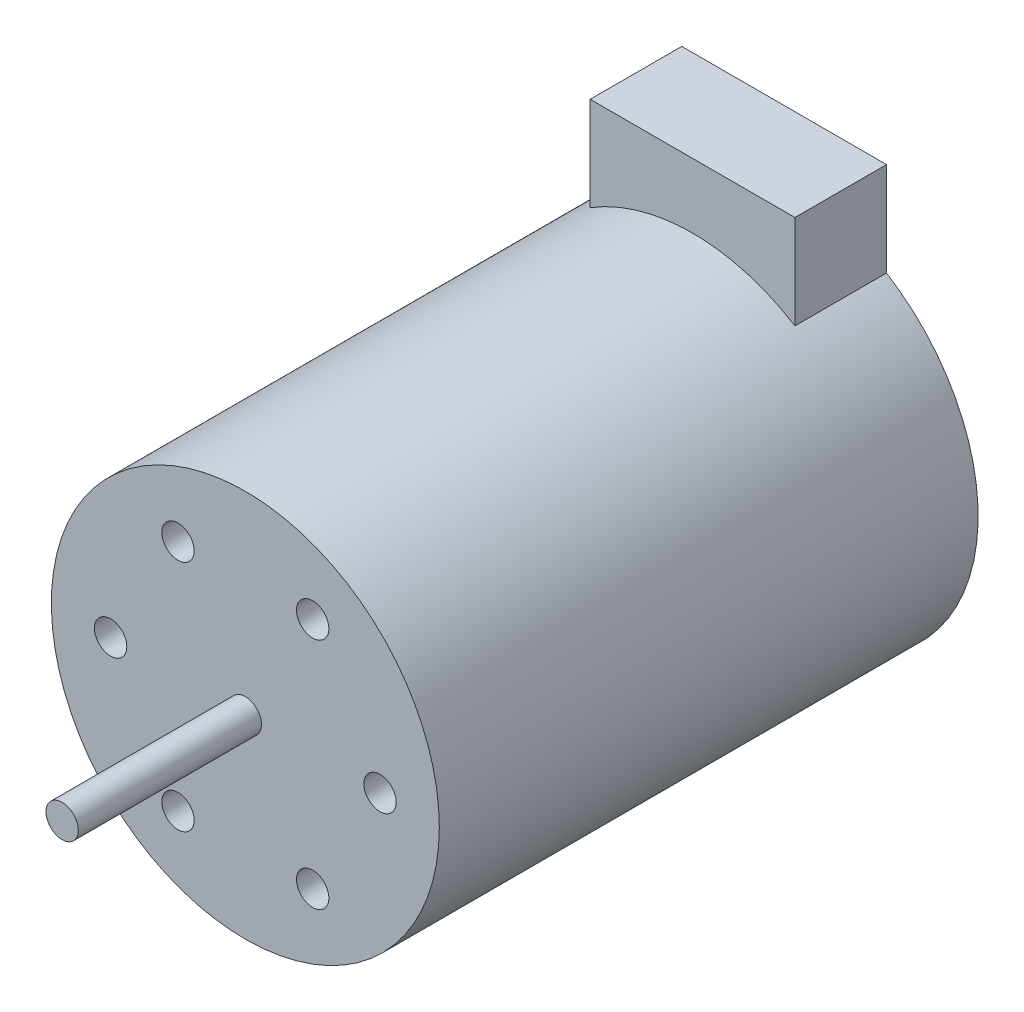
ISO-10303-21;
HEADER;
FILE_DESCRIPTION(('STEP AP214'),'2;1');
FILE_NAME('part.step','',(''),(''),'','','');
FILE_SCHEMA(('AUTOMOTIVE_DESIGN { 1 0 10303 214 1 1 1 1 }'));
ENDSEC;
DATA;
#1=APPLICATION_CONTEXT('core data for automotive mechanical design processes');
#2=APPLICATION_PROTOCOL_DEFINITION('international standard','automotive_design',2000,#1);
#3=PRODUCT_CONTEXT('',#1,'mechanical');
#4=PRODUCT('Part','Part','',(#3));
#5=PRODUCT_RELATED_PRODUCT_CATEGORY('part','',(#4));
#6=PRODUCT_DEFINITION_FORMATION('','',#4);
#7=PRODUCT_DEFINITION_CONTEXT('part definition',#1,'design');
#8=PRODUCT_DEFINITION('design','',#6,#7);
#9=PRODUCT_DEFINITION_SHAPE('','',#8);
#10=(LENGTH_UNIT() NAMED_UNIT(*) SI_UNIT(.MILLI.,.METRE.));
#11=(NAMED_UNIT(*) PLANE_ANGLE_UNIT() SI_UNIT($,.RADIAN.));
#12=(NAMED_UNIT(*) SI_UNIT($,.STERADIAN.) SOLID_ANGLE_UNIT());
#13=UNCERTAINTY_MEASURE_WITH_UNIT(LENGTH_MEASURE(1.E-05),#10,'distance_accuracy_value','');
#14=(GEOMETRIC_REPRESENTATION_CONTEXT(3) GLOBAL_UNCERTAINTY_ASSIGNED_CONTEXT((#13)) GLOBAL_UNIT_ASSIGNED_CONTEXT((#10,
#11,#12)) REPRESENTATION_CONTEXT('',''));
#15=CARTESIAN_POINT('',(0.,0.,0.));
#16=DIRECTION('',(0.,0.,1.));
#17=DIRECTION('',(1.,0.,0.));
#18=AXIS2_PLACEMENT_3D('',#15,#16,#17);
#19=CARTESIAN_POINT('',(0.,0.,50.));
#20=DIRECTION('',(0.,0.,-1.));
#21=DIRECTION('',(-1.,0.,0.));
#22=AXIS2_PLACEMENT_3D('',#19,#20,#21);
#23=CYLINDRICAL_SURFACE('',#22,18.);
#24=CARTESIAN_POINT('',(0.,0.,50.));
#25=DIRECTION('',(0.,0.,1.));
#26=DIRECTION('',(1.,0.,0.));
#27=AXIS2_PLACEMENT_3D('',#24,#25,#26);
#28=CIRCLE('',#27,18.);
#29=CARTESIAN_POINT('',(18.,0.,50.));
#30=VERTEX_POINT('',#29);
#31=EDGE_CURVE('E48',#30,#30,#28,.T.);
#32=ORIENTED_EDGE('',*,*,#31,.F.);
#33=EDGE_LOOP('',(#32));
#34=FACE_BOUND('',#33,.T.);
#35=DIRECTION('',(0.,0.,-1.));
#36=VECTOR('',#35,1.);
#37=CARTESIAN_POINT('',(9.49999999999999,15.2888848514207,50.));
#38=LINE('',#37,#36);
#39=CARTESIAN_POINT('',(9.5,15.2888848514207,8.5));
#40=VERTEX_POINT('',#39);
#41=CARTESIAN_POINT('',(9.5,15.2888848514207,0.));
#42=VERTEX_POINT('',#41);
#43=EDGE_CURVE('E100',#40,#42,#38,.T.);
#44=ORIENTED_EDGE('',*,*,#43,.F.);
#45=CARTESIAN_POINT('',(0.,0.,8.5));
#46=DIRECTION('',(0.,0.,-1.));
#47=DIRECTION('',(-1.,0.,0.));
#48=AXIS2_PLACEMENT_3D('',#45,#46,#47);
#49=CIRCLE('',#48,18.);
#50=CARTESIAN_POINT('',(-9.5,15.2888848514207,8.5));
#51=VERTEX_POINT('',#50);
#52=EDGE_CURVE('E11',#51,#40,#49,.T.);
#53=ORIENTED_EDGE('',*,*,#52,.F.);
#54=DIRECTION('',(0.,0.,-1.));
#55=VECTOR('',#54,1.);
#56=CARTESIAN_POINT('',(-9.5,15.2888848514207,50.));
#57=LINE('',#56,#55);
#58=CARTESIAN_POINT('',(-9.5,15.2888848514207,0.));
#59=VERTEX_POINT('',#58);
#60=EDGE_CURVE('E57',#59,#51,#57,.F.);
#61=ORIENTED_EDGE('',*,*,#60,.F.);
#62=CARTESIAN_POINT('',(0.,0.,0.));
#63=DIRECTION('',(0.,0.,1.));
#64=DIRECTION('',(1.,0.,0.));
#65=AXIS2_PLACEMENT_3D('',#62,#63,#64);
#66=CIRCLE('',#65,18.);
#67=EDGE_CURVE('E112',#59,#42,#66,.T.);
#68=ORIENTED_EDGE('',*,*,#67,.T.);
#69=EDGE_LOOP('',(#44,#53,#61,#68));
#70=FACE_BOUND('',#69,.T.);
#71=ADVANCED_FACE('F41',(#34,#70),#23,.T.);
#72=CARTESIAN_POINT('',(0.,0.,50.));
#73=DIRECTION('',(0.,0.,1.));
#74=DIRECTION('',(1.,0.,0.));
#75=AXIS2_PLACEMENT_3D('',#72,#73,#74);
#76=PLANE('',#75);
#77=CARTESIAN_POINT('',(12.5,0.,50.));
#78=DIRECTION('',(0.,0.,1.));
#79=DIRECTION('',(1.,0.,0.));
#80=AXIS2_PLACEMENT_3D('',#77,#78,#79);
#81=CIRCLE('',#80,1.5);
#82=CARTESIAN_POINT('',(14.,0.,50.));
#83=VERTEX_POINT('',#82);
#84=EDGE_CURVE('E304',#83,#83,#81,.T.);
#85=ORIENTED_EDGE('',*,*,#84,.F.);
#86=EDGE_LOOP('',(#85));
#87=FACE_BOUND('',#86,.T.);
#88=CARTESIAN_POINT('',(6.25000000000013,10.8253175473054,50.));
#89=DIRECTION('',(0.,0.,1.));
#90=DIRECTION('',(1.,0.,0.));
#91=AXIS2_PLACEMENT_3D('',#88,#89,#90);
#92=CIRCLE('',#91,1.5);
#93=CARTESIAN_POINT('',(7.75000000000013,10.8253175473054,50.));
#94=VERTEX_POINT('',#93);
#95=EDGE_CURVE('E310',#94,#94,#92,.T.);
#96=ORIENTED_EDGE('',*,*,#95,.F.);
#97=EDGE_LOOP('',(#96));
#98=FACE_BOUND('',#97,.T.);
#99=CARTESIAN_POINT('',(-6.2499999999999,10.8253175473055,50.));
#100=DIRECTION('',(0.,0.,1.));
#101=DIRECTION('',(1.,0.,0.));
#102=AXIS2_PLACEMENT_3D('',#99,#100,#101);
#103=CIRCLE('',#102,1.5);
#104=CARTESIAN_POINT('',(-4.7499999999999,10.8253175473055,50.));
#105=VERTEX_POINT('',#104);
#106=EDGE_CURVE('E334',#105,#105,#103,.T.);
#107=ORIENTED_EDGE('',*,*,#106,.F.);
#108=EDGE_LOOP('',(#107));
#109=FACE_BOUND('',#108,.T.);
#110=CARTESIAN_POINT('',(-12.5,0.,50.));
#111=DIRECTION('',(0.,0.,1.));
#112=DIRECTION('',(1.,0.,0.));
#113=AXIS2_PLACEMENT_3D('',#110,#111,#112);
#114=CIRCLE('',#113,1.5);
#115=CARTESIAN_POINT('',(-11.,0.,50.));
#116=VERTEX_POINT('',#115);
#117=EDGE_CURVE('E328',#116,#116,#114,.T.);
#118=ORIENTED_EDGE('',*,*,#117,.F.);
#119=EDGE_LOOP('',(#118));
#120=FACE_BOUND('',#119,.T.);
#121=CARTESIAN_POINT('',(-6.25000000000005,-10.8253175473055,50.));
#122=DIRECTION('',(0.,0.,1.));
#123=DIRECTION('',(1.,0.,0.));
#124=AXIS2_PLACEMENT_3D('',#121,#122,#123);
#125=CIRCLE('',#124,1.5);
#126=CARTESIAN_POINT('',(-4.75000000000005,-10.8253175473055,50.));
#127=VERTEX_POINT('',#126);
#128=EDGE_CURVE('E322',#127,#127,#125,.T.);
#129=ORIENTED_EDGE('',*,*,#128,.F.);
#130=EDGE_LOOP('',(#129));
#131=FACE_BOUND('',#130,.T.);
#132=CARTESIAN_POINT('',(6.24999999999998,-10.8253175473055,50.));
#133=DIRECTION('',(0.,0.,1.));
#134=DIRECTION('',(1.,0.,0.));
#135=AXIS2_PLACEMENT_3D('',#132,#133,#134);
#136=CIRCLE('',#135,1.5);
#137=CARTESIAN_POINT('',(7.74999999999998,-10.8253175473055,50.));
#138=VERTEX_POINT('',#137);
#139=EDGE_CURVE('E307',#138,#138,#136,.T.);
#140=ORIENTED_EDGE('',*,*,#139,.F.);
#141=EDGE_LOOP('',(#140));
#142=FACE_BOUND('',#141,.T.);
#143=CARTESIAN_POINT('',(0.,0.,50.));
#144=DIRECTION('',(0.,0.,1.));
#145=DIRECTION('',(1.,0.,0.));
#146=AXIS2_PLACEMENT_3D('',#143,#144,#145);
#147=CIRCLE('',#146,1.5);
#148=CARTESIAN_POINT('',(1.5,0.,50.));
#149=VERTEX_POINT('',#148);
#150=EDGE_CURVE('E108',#149,#149,#147,.T.);
#151=ORIENTED_EDGE('',*,*,#150,.F.);
#152=EDGE_LOOP('',(#151));
#153=FACE_BOUND('',#152,.T.);
#154=ORIENTED_EDGE('',*,*,#31,.T.);
#155=EDGE_LOOP('',(#154));
#156=FACE_BOUND('',#155,.T.);
#157=ADVANCED_FACE('F136',(#87,#98,#109,#120,#131,#142,#153,#156),#76,.T.);
#158=CARTESIAN_POINT('',(0.,0.,0.));
#159=DIRECTION('',(0.,0.,1.));
#160=DIRECTION('',(1.,0.,0.));
#161=AXIS2_PLACEMENT_3D('',#158,#159,#160);
#162=PLANE('',#161);
#163=ORIENTED_EDGE('',*,*,#67,.F.);
#164=DIRECTION('',(0.,-1.,0.));
#165=VECTOR('',#164,1.);
#166=CARTESIAN_POINT('',(-9.5,24.,0.));
#167=LINE('',#166,#165);
#168=CARTESIAN_POINT('',(-9.5,24.,0.));
#169=VERTEX_POINT('',#168);
#170=EDGE_CURVE('E83',#169,#59,#167,.T.);
#171=ORIENTED_EDGE('',*,*,#170,.F.);
#172=DIRECTION('',(-1.,0.,0.));
#173=VECTOR('',#172,1.);
#174=CARTESIAN_POINT('',(-9.5,24.,0.));
#175=LINE('',#174,#173);
#176=CARTESIAN_POINT('',(9.5,24.,0.));
#177=VERTEX_POINT('',#176);
#178=EDGE_CURVE('E77',#177,#169,#175,.T.);
#179=ORIENTED_EDGE('',*,*,#178,.F.);
#180=DIRECTION('',(0.,-1.,0.));
#181=VECTOR('',#180,1.);
#182=CARTESIAN_POINT('',(9.5,24.,0.));
#183=LINE('',#182,#181);
#184=EDGE_CURVE('E81',#177,#42,#183,.T.);
#185=ORIENTED_EDGE('',*,*,#184,.T.);
#186=EDGE_LOOP('',(#163,#171,#179,#185));
#187=FACE_BOUND('',#186,.T.);
#188=ADVANCED_FACE('F79',(#187),#162,.F.);
#189=CARTESIAN_POINT('',(0.,0.,67.));
#190=DIRECTION('',(0.,0.,-1.));
#191=DIRECTION('',(-1.,0.,0.));
#192=AXIS2_PLACEMENT_3D('',#189,#190,#191);
#193=CYLINDRICAL_SURFACE('',#192,1.5);
#194=CARTESIAN_POINT('',(0.,0.,67.));
#195=DIRECTION('',(0.,0.,1.));
#196=DIRECTION('',(1.,0.,0.));
#197=AXIS2_PLACEMENT_3D('',#194,#195,#196);
#198=CIRCLE('',#197,1.5);
#199=CARTESIAN_POINT('',(1.5,0.,67.));
#200=VERTEX_POINT('',#199);
#201=EDGE_CURVE('E109',#200,#200,#198,.T.);
#202=ORIENTED_EDGE('',*,*,#201,.F.);
#203=EDGE_LOOP('',(#202));
#204=FACE_BOUND('',#203,.T.);
#205=ORIENTED_EDGE('',*,*,#150,.T.);
#206=EDGE_LOOP('',(#205));
#207=FACE_BOUND('',#206,.T.);
#208=ADVANCED_FACE('F150',(#204,#207),#193,.T.);
#209=CARTESIAN_POINT('',(0.,0.,67.));
#210=DIRECTION('',(0.,0.,1.));
#211=DIRECTION('',(1.,0.,0.));
#212=AXIS2_PLACEMENT_3D('',#209,#210,#211);
#213=PLANE('',#212);
#214=ORIENTED_EDGE('',*,*,#201,.T.);
#215=EDGE_LOOP('',(#214));
#216=FACE_BOUND('',#215,.T.);
#217=ADVANCED_FACE('F156',(#216),#213,.T.);
#218=CARTESIAN_POINT('',(9.5,24.,8.5));
#219=DIRECTION('',(-1.,0.,0.));
#220=DIRECTION('',(0.,0.,1.));
#221=AXIS2_PLACEMENT_3D('',#218,#219,#220);
#222=PLANE('',#221);
#223=DIRECTION('',(0.,-1.,0.));
#224=VECTOR('',#223,1.);
#225=CARTESIAN_POINT('',(9.5,24.,8.5));
#226=LINE('',#225,#224);
#227=CARTESIAN_POINT('',(9.5,24.,8.5));
#228=VERTEX_POINT('',#227);
#229=EDGE_CURVE('E121',#228,#40,#226,.T.);
#230=ORIENTED_EDGE('',*,*,#229,.T.);
#231=ORIENTED_EDGE('',*,*,#43,.T.);
#232=ORIENTED_EDGE('',*,*,#184,.F.);
#233=DIRECTION('',(0.,0.,-1.));
#234=VECTOR('',#233,1.);
#235=CARTESIAN_POINT('',(9.5,24.,8.5));
#236=LINE('',#235,#234);
#237=EDGE_CURVE('E87',#228,#177,#236,.T.);
#238=ORIENTED_EDGE('',*,*,#237,.F.);
#239=EDGE_LOOP('',(#230,#231,#232,#238));
#240=FACE_BOUND('',#239,.T.);
#241=ADVANCED_FACE('F99',(#240),#222,.F.);
#242=CARTESIAN_POINT('',(-9.5,24.,8.5));
#243=DIRECTION('',(1.,0.,0.));
#244=DIRECTION('',(0.,0.,-1.));
#245=AXIS2_PLACEMENT_3D('',#242,#243,#244);
#246=PLANE('',#245);
#247=ORIENTED_EDGE('',*,*,#170,.T.);
#248=ORIENTED_EDGE('',*,*,#60,.T.);
#249=DIRECTION('',(0.,-1.,0.));
#250=VECTOR('',#249,1.);
#251=CARTESIAN_POINT('',(-9.5,24.,8.5));
#252=LINE('',#251,#250);
#253=CARTESIAN_POINT('',(-9.5,24.,8.5));
#254=VERTEX_POINT('',#253);
#255=EDGE_CURVE('E103',#254,#51,#252,.T.);
#256=ORIENTED_EDGE('',*,*,#255,.F.);
#257=DIRECTION('',(0.,0.,1.));
#258=VECTOR('',#257,1.);
#259=CARTESIAN_POINT('',(-9.5,24.,8.5));
#260=LINE('',#259,#258);
#261=EDGE_CURVE('E86',#169,#254,#260,.T.);
#262=ORIENTED_EDGE('',*,*,#261,.F.);
#263=EDGE_LOOP('',(#247,#248,#256,#262));
#264=FACE_BOUND('',#263,.T.);
#265=ADVANCED_FACE('F117',(#264),#246,.F.);
#266=CARTESIAN_POINT('',(-9.5,24.,8.5));
#267=DIRECTION('',(0.,0.,-1.));
#268=DIRECTION('',(-1.,0.,0.));
#269=AXIS2_PLACEMENT_3D('',#266,#267,#268);
#270=PLANE('',#269);
#271=ORIENTED_EDGE('',*,*,#255,.T.);
#272=ORIENTED_EDGE('',*,*,#52,.T.);
#273=ORIENTED_EDGE('',*,*,#229,.F.);
#274=DIRECTION('',(1.,0.,0.));
#275=VECTOR('',#274,1.);
#276=CARTESIAN_POINT('',(-9.5,24.,8.5));
#277=LINE('',#276,#275);
#278=EDGE_CURVE('E92',#254,#228,#277,.T.);
#279=ORIENTED_EDGE('',*,*,#278,.F.);
#280=EDGE_LOOP('',(#271,#272,#273,#279));
#281=FACE_BOUND('',#280,.T.);
#282=ADVANCED_FACE('F125',(#281),#270,.F.);
#283=CARTESIAN_POINT('',(0.,24.,0.));
#284=DIRECTION('',(0.,-1.,0.));
#285=DIRECTION('',(0.,0.,-1.));
#286=AXIS2_PLACEMENT_3D('',#283,#284,#285);
#287=PLANE('',#286);
#288=ORIENTED_EDGE('',*,*,#237,.T.);
#289=ORIENTED_EDGE('',*,*,#178,.T.);
#290=ORIENTED_EDGE('',*,*,#261,.T.);
#291=ORIENTED_EDGE('',*,*,#278,.T.);
#292=EDGE_LOOP('',(#288,#289,#290,#291));
#293=FACE_BOUND('',#292,.T.);
#294=ADVANCED_FACE('F90',(#293),#287,.F.);
#295=CARTESIAN_POINT('',(6.24999999999998,-10.8253175473055,45.));
#296=DIRECTION('',(0.,0.,1.));
#297=DIRECTION('',(1.,0.,0.));
#298=AXIS2_PLACEMENT_3D('',#295,#296,#297);
#299=CYLINDRICAL_SURFACE('',#298,1.5);
#300=CARTESIAN_POINT('',(6.24999999999998,-10.8253175473055,45.));
#301=DIRECTION('',(0.,0.,1.));
#302=DIRECTION('',(1.,0.,0.));
#303=AXIS2_PLACEMENT_3D('',#300,#301,#302);
#304=CIRCLE('',#303,1.5);
#305=CARTESIAN_POINT('',(7.74999999999998,-10.8253175473055,45.));
#306=VERTEX_POINT('',#305);
#307=EDGE_CURVE('E319',#306,#306,#304,.T.);
#308=ORIENTED_EDGE('',*,*,#307,.F.);
#309=EDGE_LOOP('',(#308));
#310=FACE_BOUND('',#309,.T.);
#311=ORIENTED_EDGE('',*,*,#139,.T.);
#312=EDGE_LOOP('',(#311));
#313=FACE_BOUND('',#312,.T.);
#314=ADVANCED_FACE('F132',(#310,#313),#299,.F.);
#315=CARTESIAN_POINT('',(6.24999999999998,-10.8253175473055,45.));
#316=DIRECTION('',(0.,0.,1.));
#317=DIRECTION('',(1.,0.,0.));
#318=AXIS2_PLACEMENT_3D('',#315,#316,#317);
#319=PLANE('',#318);
#320=ORIENTED_EDGE('',*,*,#307,.T.);
#321=EDGE_LOOP('',(#320));
#322=FACE_BOUND('',#321,.T.);
#323=ADVANCED_FACE('F189',(#322),#319,.T.);
#324=CARTESIAN_POINT('',(-6.25000000000005,-10.8253175473055,45.));
#325=DIRECTION('',(0.,0.,1.));
#326=DIRECTION('',(1.,0.,0.));
#327=AXIS2_PLACEMENT_3D('',#324,#325,#326);
#328=CYLINDRICAL_SURFACE('',#327,1.5);
#329=CARTESIAN_POINT('',(-6.25000000000005,-10.8253175473055,45.));
#330=DIRECTION('',(0.,0.,1.));
#331=DIRECTION('',(1.,0.,0.));
#332=AXIS2_PLACEMENT_3D('',#329,#330,#331);
#333=CIRCLE('',#332,1.5);
#334=CARTESIAN_POINT('',(-4.75000000000005,-10.8253175473055,45.));
#335=VERTEX_POINT('',#334);
#336=EDGE_CURVE('E325',#335,#335,#333,.T.);
#337=ORIENTED_EDGE('',*,*,#336,.F.);
#338=EDGE_LOOP('',(#337));
#339=FACE_BOUND('',#338,.T.);
#340=ORIENTED_EDGE('',*,*,#128,.T.);
#341=EDGE_LOOP('',(#340));
#342=FACE_BOUND('',#341,.T.);
#343=ADVANCED_FACE('F199',(#339,#342),#328,.F.);
#344=CARTESIAN_POINT('',(-6.25000000000005,-10.8253175473055,45.));
#345=DIRECTION('',(0.,0.,1.));
#346=DIRECTION('',(1.,0.,0.));
#347=AXIS2_PLACEMENT_3D('',#344,#345,#346);
#348=PLANE('',#347);
#349=ORIENTED_EDGE('',*,*,#336,.T.);
#350=EDGE_LOOP('',(#349));
#351=FACE_BOUND('',#350,.T.);
#352=ADVANCED_FACE('F209',(#351),#348,.T.);
#353=CARTESIAN_POINT('',(-12.5,0.,45.));
#354=DIRECTION('',(0.,0.,1.));
#355=DIRECTION('',(1.,0.,0.));
#356=AXIS2_PLACEMENT_3D('',#353,#354,#355);
#357=CYLINDRICAL_SURFACE('',#356,1.5);
#358=CARTESIAN_POINT('',(-12.5,0.,45.));
#359=DIRECTION('',(0.,0.,1.));
#360=DIRECTION('',(1.,0.,0.));
#361=AXIS2_PLACEMENT_3D('',#358,#359,#360);
#362=CIRCLE('',#361,1.5);
#363=CARTESIAN_POINT('',(-11.,0.,45.));
#364=VERTEX_POINT('',#363);
#365=EDGE_CURVE('E331',#364,#364,#362,.T.);
#366=ORIENTED_EDGE('',*,*,#365,.F.);
#367=EDGE_LOOP('',(#366));
#368=FACE_BOUND('',#367,.T.);
#369=ORIENTED_EDGE('',*,*,#117,.T.);
#370=EDGE_LOOP('',(#369));
#371=FACE_BOUND('',#370,.T.);
#372=ADVANCED_FACE('F219',(#368,#371),#357,.F.);
#373=CARTESIAN_POINT('',(-12.5,0.,45.));
#374=DIRECTION('',(0.,0.,1.));
#375=DIRECTION('',(1.,0.,0.));
#376=AXIS2_PLACEMENT_3D('',#373,#374,#375);
#377=PLANE('',#376);
#378=ORIENTED_EDGE('',*,*,#365,.T.);
#379=EDGE_LOOP('',(#378));
#380=FACE_BOUND('',#379,.T.);
#381=ADVANCED_FACE('F229',(#380),#377,.T.);
#382=CARTESIAN_POINT('',(-6.2499999999999,10.8253175473055,45.));
#383=DIRECTION('',(0.,0.,1.));
#384=DIRECTION('',(1.,0.,0.));
#385=AXIS2_PLACEMENT_3D('',#382,#383,#384);
#386=CYLINDRICAL_SURFACE('',#385,1.5);
#387=CARTESIAN_POINT('',(-6.2499999999999,10.8253175473055,45.));
#388=DIRECTION('',(0.,0.,1.));
#389=DIRECTION('',(1.,0.,0.));
#390=AXIS2_PLACEMENT_3D('',#387,#388,#389);
#391=CIRCLE('',#390,1.5);
#392=CARTESIAN_POINT('',(-4.7499999999999,10.8253175473055,45.));
#393=VERTEX_POINT('',#392);
#394=EDGE_CURVE('E313',#393,#393,#391,.T.);
#395=ORIENTED_EDGE('',*,*,#394,.F.);
#396=EDGE_LOOP('',(#395));
#397=FACE_BOUND('',#396,.T.);
#398=ORIENTED_EDGE('',*,*,#106,.T.);
#399=EDGE_LOOP('',(#398));
#400=FACE_BOUND('',#399,.T.);
#401=ADVANCED_FACE('F239',(#397,#400),#386,.F.);
#402=CARTESIAN_POINT('',(-6.2499999999999,10.8253175473055,45.));
#403=DIRECTION('',(0.,0.,1.));
#404=DIRECTION('',(1.,0.,0.));
#405=AXIS2_PLACEMENT_3D('',#402,#403,#404);
#406=PLANE('',#405);
#407=ORIENTED_EDGE('',*,*,#394,.T.);
#408=EDGE_LOOP('',(#407));
#409=FACE_BOUND('',#408,.T.);
#410=ADVANCED_FACE('F249',(#409),#406,.T.);
#411=CARTESIAN_POINT('',(6.25000000000013,10.8253175473054,45.));
#412=DIRECTION('',(0.,0.,1.));
#413=DIRECTION('',(1.,0.,0.));
#414=AXIS2_PLACEMENT_3D('',#411,#412,#413);
#415=CYLINDRICAL_SURFACE('',#414,1.5);
#416=CARTESIAN_POINT('',(6.25000000000013,10.8253175473054,45.));
#417=DIRECTION('',(0.,0.,1.));
#418=DIRECTION('',(1.,0.,0.));
#419=AXIS2_PLACEMENT_3D('',#416,#417,#418);
#420=CIRCLE('',#419,1.5);
#421=CARTESIAN_POINT('',(7.75000000000013,10.8253175473054,45.));
#422=VERTEX_POINT('',#421);
#423=EDGE_CURVE('E314',#422,#422,#420,.T.);
#424=ORIENTED_EDGE('',*,*,#423,.F.);
#425=EDGE_LOOP('',(#424));
#426=FACE_BOUND('',#425,.T.);
#427=ORIENTED_EDGE('',*,*,#95,.T.);
#428=EDGE_LOOP('',(#427));
#429=FACE_BOUND('',#428,.T.);
#430=ADVANCED_FACE('F259',(#426,#429),#415,.F.);
#431=CARTESIAN_POINT('',(6.25000000000013,10.8253175473054,45.));
#432=DIRECTION('',(0.,0.,1.));
#433=DIRECTION('',(1.,0.,0.));
#434=AXIS2_PLACEMENT_3D('',#431,#432,#433);
#435=PLANE('',#434);
#436=ORIENTED_EDGE('',*,*,#423,.T.);
#437=EDGE_LOOP('',(#436));
#438=FACE_BOUND('',#437,.T.);
#439=ADVANCED_FACE('F269',(#438),#435,.T.);
#440=CARTESIAN_POINT('',(12.5,0.,45.));
#441=DIRECTION('',(0.,0.,1.));
#442=DIRECTION('',(1.,0.,0.));
#443=AXIS2_PLACEMENT_3D('',#440,#441,#442);
#444=CYLINDRICAL_SURFACE('',#443,1.5);
#445=CARTESIAN_POINT('',(12.5,0.,45.));
#446=DIRECTION('',(0.,0.,1.));
#447=DIRECTION('',(1.,0.,0.));
#448=AXIS2_PLACEMENT_3D('',#445,#446,#447);
#449=CIRCLE('',#448,1.5);
#450=CARTESIAN_POINT('',(14.,0.,45.));
#451=VERTEX_POINT('',#450);
#452=EDGE_CURVE('E96',#451,#451,#449,.T.);
#453=ORIENTED_EDGE('',*,*,#452,.F.);
#454=EDGE_LOOP('',(#453));
#455=FACE_BOUND('',#454,.T.);
#456=ORIENTED_EDGE('',*,*,#84,.T.);
#457=EDGE_LOOP('',(#456));
#458=FACE_BOUND('',#457,.T.);
#459=ADVANCED_FACE('F279',(#455,#458),#444,.F.);
#460=CARTESIAN_POINT('',(12.5,0.,45.));
#461=DIRECTION('',(0.,0.,1.));
#462=DIRECTION('',(1.,0.,0.));
#463=AXIS2_PLACEMENT_3D('',#460,#461,#462);
#464=PLANE('',#463);
#465=ORIENTED_EDGE('',*,*,#452,.T.);
#466=EDGE_LOOP('',(#465));
#467=FACE_BOUND('',#466,.T.);
#468=ADVANCED_FACE('F289',(#467),#464,.T.);
#469=CLOSED_SHELL('',(#71,#157,#188,#208,#217,#241,#265,#282,#294,#314,#323,#343,#352,#372,#381,
#401,#410,#430,#439,#459,#468));
#470=MANIFOLD_SOLID_BREP('B2',#469);
#471=ADVANCED_BREP_SHAPE_REPRESENTATION('',(#18,#470),#14);
#472=SHAPE_DEFINITION_REPRESENTATION(#9,#471);
ENDSEC;
END-ISO-10303-21;
